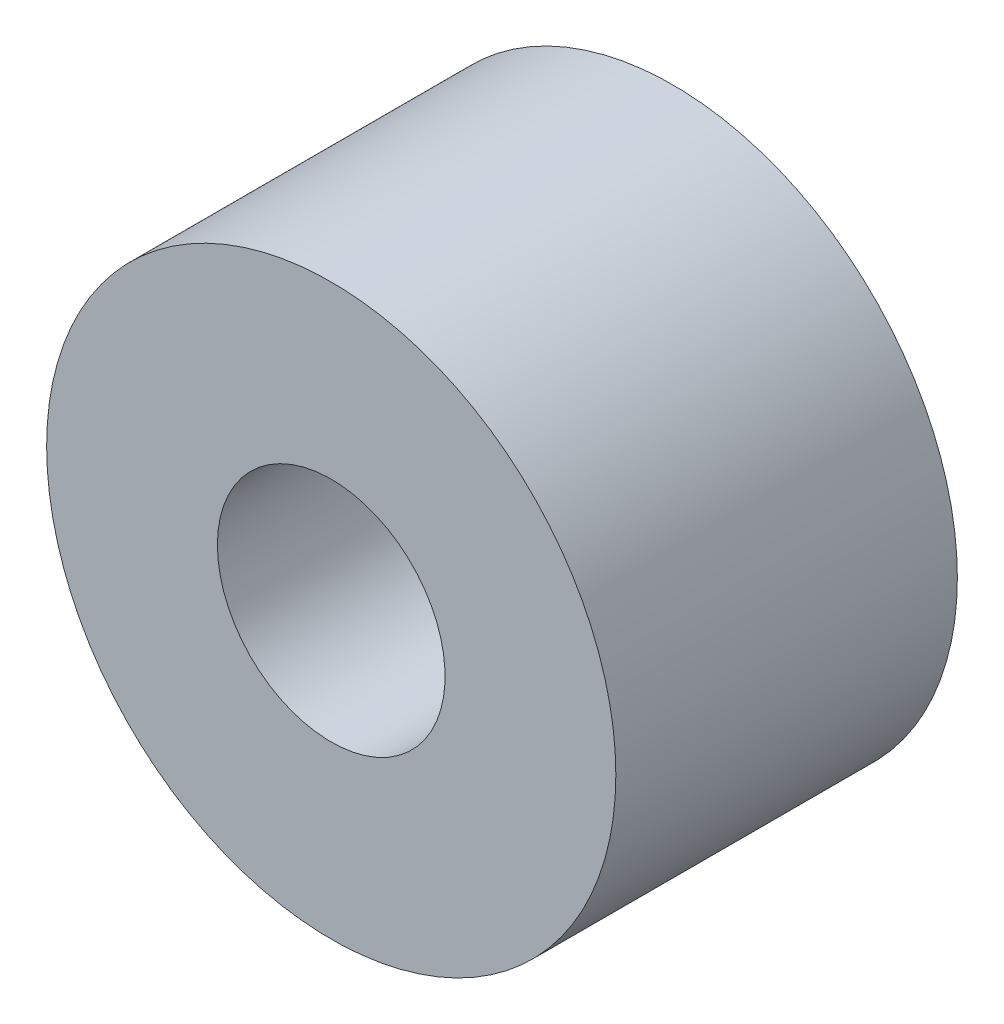
ISO-10303-21;
HEADER;
FILE_DESCRIPTION(('STEP AP214'),'2;1');
FILE_NAME('part.step','',(''),(''),'','','');
FILE_SCHEMA(('AUTOMOTIVE_DESIGN { 1 0 10303 214 1 1 1 1 }'));
ENDSEC;
DATA;
#1=APPLICATION_CONTEXT('core data for automotive mechanical design processes');
#2=APPLICATION_PROTOCOL_DEFINITION('international standard','automotive_design',2000,#1);
#3=PRODUCT_CONTEXT('',#1,'mechanical');
#4=PRODUCT('Part','Part','',(#3));
#5=PRODUCT_RELATED_PRODUCT_CATEGORY('part','',(#4));
#6=PRODUCT_DEFINITION_FORMATION('','',#4);
#7=PRODUCT_DEFINITION_CONTEXT('part definition',#1,'design');
#8=PRODUCT_DEFINITION('design','',#6,#7);
#9=PRODUCT_DEFINITION_SHAPE('','',#8);
#10=(LENGTH_UNIT() NAMED_UNIT(*) SI_UNIT(.MILLI.,.METRE.));
#11=(NAMED_UNIT(*) PLANE_ANGLE_UNIT() SI_UNIT($,.RADIAN.));
#12=(NAMED_UNIT(*) SI_UNIT($,.STERADIAN.) SOLID_ANGLE_UNIT());
#13=UNCERTAINTY_MEASURE_WITH_UNIT(LENGTH_MEASURE(1.E-05),#10,'distance_accuracy_value','');
#14=(GEOMETRIC_REPRESENTATION_CONTEXT(3) GLOBAL_UNCERTAINTY_ASSIGNED_CONTEXT((#13)) GLOBAL_UNIT_ASSIGNED_CONTEXT((#10,
#11,#12)) REPRESENTATION_CONTEXT('',''));
#15=CARTESIAN_POINT('',(0.,0.,0.));
#16=DIRECTION('',(0.,0.,1.));
#17=DIRECTION('',(1.,0.,0.));
#18=AXIS2_PLACEMENT_3D('',#15,#16,#17);
#19=CARTESIAN_POINT('',(0.,0.,45.));
#20=DIRECTION('',(0.,0.,1.));
#21=DIRECTION('',(1.,0.,0.));
#22=AXIS2_PLACEMENT_3D('',#19,#20,#21);
#23=PLANE('',#22);
#24=CARTESIAN_POINT('',(0.,0.,45.));
#25=DIRECTION('',(0.,0.,1.));
#26=DIRECTION('',(1.,0.,0.));
#27=AXIS2_PLACEMENT_3D('',#24,#25,#26);
#28=CIRCLE('',#27,37.5);
#29=CARTESIAN_POINT('',(-37.5,0.,45.));
#30=VERTEX_POINT('',#29);
#31=EDGE_CURVE('E10',#30,#30,#28,.T.);
#32=ORIENTED_EDGE('',*,*,#31,.T.);
#33=EDGE_LOOP('',(#32));
#34=FACE_BOUND('',#33,.T.);
#35=CARTESIAN_POINT('',(0.,0.,45.));
#36=DIRECTION('',(0.,0.,1.));
#37=DIRECTION('',(1.,0.,0.));
#38=AXIS2_PLACEMENT_3D('',#35,#36,#37);
#39=CIRCLE('',#38,15.);
#40=CARTESIAN_POINT('',(-15.,0.,45.));
#41=VERTEX_POINT('',#40);
#42=EDGE_CURVE('E55',#41,#41,#39,.T.);
#43=ORIENTED_EDGE('',*,*,#42,.F.);
#44=EDGE_LOOP('',(#43));
#45=FACE_BOUND('',#44,.T.);
#46=ADVANCED_FACE('F41',(#34,#45),#23,.T.);
#47=CARTESIAN_POINT('',(0.,0.,0.));
#48=DIRECTION('',(0.,0.,1.));
#49=DIRECTION('',(1.,0.,0.));
#50=AXIS2_PLACEMENT_3D('',#47,#48,#49);
#51=PLANE('',#50);
#52=CARTESIAN_POINT('',(0.,0.,0.));
#53=DIRECTION('',(0.,0.,1.));
#54=DIRECTION('',(1.,0.,0.));
#55=AXIS2_PLACEMENT_3D('',#52,#53,#54);
#56=CIRCLE('',#55,37.5);
#57=CARTESIAN_POINT('',(-37.5,0.,0.));
#58=VERTEX_POINT('',#57);
#59=EDGE_CURVE('E44',#58,#58,#56,.T.);
#60=ORIENTED_EDGE('',*,*,#59,.F.);
#61=EDGE_LOOP('',(#60));
#62=FACE_BOUND('',#61,.T.);
#63=CARTESIAN_POINT('',(0.,0.,0.));
#64=DIRECTION('',(0.,0.,1.));
#65=DIRECTION('',(1.,0.,0.));
#66=AXIS2_PLACEMENT_3D('',#63,#64,#65);
#67=CIRCLE('',#66,15.);
#68=CARTESIAN_POINT('',(-15.,0.,0.));
#69=VERTEX_POINT('',#68);
#70=EDGE_CURVE('E53',#69,#69,#67,.T.);
#71=ORIENTED_EDGE('',*,*,#70,.T.);
#72=EDGE_LOOP('',(#71));
#73=FACE_BOUND('',#72,.T.);
#74=ADVANCED_FACE('F61',(#62,#73),#51,.F.);
#75=CARTESIAN_POINT('',(0.,0.,45.));
#76=DIRECTION('',(0.,0.,-1.));
#77=DIRECTION('',(-1.,0.,0.));
#78=AXIS2_PLACEMENT_3D('',#75,#76,#77);
#79=CYLINDRICAL_SURFACE('',#78,37.5);
#80=CARTESIAN_POINT('',(-37.5,0.,45.));
#81=CARTESIAN_POINT('',(-37.5,0.,44.53125));
#82=CARTESIAN_POINT('',(-37.5,0.,44.0625));
#83=CARTESIAN_POINT('',(-37.5,0.,43.125));
#84=CARTESIAN_POINT('',(-37.5,0.,42.65625));
#85=CARTESIAN_POINT('',(-37.5,0.,41.71875));
#86=CARTESIAN_POINT('',(-37.5,0.,41.25));
#87=CARTESIAN_POINT('',(-37.5,0.,40.3125));
#88=CARTESIAN_POINT('',(-37.5,0.,39.84375));
#89=CARTESIAN_POINT('',(-37.5,0.,38.90625));
#90=CARTESIAN_POINT('',(-37.5,0.,38.4375));
#91=CARTESIAN_POINT('',(-37.5,0.,37.5));
#92=CARTESIAN_POINT('',(-37.5,0.,37.03125));
#93=CARTESIAN_POINT('',(-37.5,0.,36.09375));
#94=CARTESIAN_POINT('',(-37.5,0.,35.625));
#95=CARTESIAN_POINT('',(-37.5,0.,34.6875));
#96=CARTESIAN_POINT('',(-37.5,0.,34.21875));
#97=CARTESIAN_POINT('',(-37.5,0.,33.28125));
#98=CARTESIAN_POINT('',(-37.5,0.,32.8125));
#99=CARTESIAN_POINT('',(-37.5,0.,31.875));
#100=CARTESIAN_POINT('',(-37.5,0.,31.40625));
#101=CARTESIAN_POINT('',(-37.5,0.,30.46875));
#102=CARTESIAN_POINT('',(-37.5,0.,30.));
#103=CARTESIAN_POINT('',(-37.5,0.,29.0625));
#104=CARTESIAN_POINT('',(-37.5,0.,28.59375));
#105=CARTESIAN_POINT('',(-37.5,0.,27.65625));
#106=CARTESIAN_POINT('',(-37.5,0.,27.1875));
#107=CARTESIAN_POINT('',(-37.5,0.,26.25));
#108=CARTESIAN_POINT('',(-37.5,0.,25.78125));
#109=CARTESIAN_POINT('',(-37.5,0.,24.84375));
#110=CARTESIAN_POINT('',(-37.5,0.,24.375));
#111=CARTESIAN_POINT('',(-37.5,0.,23.4375));
#112=CARTESIAN_POINT('',(-37.5,0.,22.96875));
#113=CARTESIAN_POINT('',(-37.5,0.,22.03125));
#114=CARTESIAN_POINT('',(-37.5,0.,21.5625));
#115=CARTESIAN_POINT('',(-37.5,0.,20.625));
#116=CARTESIAN_POINT('',(-37.5,0.,20.15625));
#117=CARTESIAN_POINT('',(-37.5,0.,19.21875));
#118=CARTESIAN_POINT('',(-37.5,0.,18.75));
#119=CARTESIAN_POINT('',(-37.5,0.,17.8125));
#120=CARTESIAN_POINT('',(-37.5,0.,17.34375));
#121=CARTESIAN_POINT('',(-37.5,0.,16.40625));
#122=CARTESIAN_POINT('',(-37.5,0.,15.9375));
#123=CARTESIAN_POINT('',(-37.5,0.,15.));
#124=CARTESIAN_POINT('',(-37.5,0.,14.53125));
#125=CARTESIAN_POINT('',(-37.5,0.,13.59375));
#126=CARTESIAN_POINT('',(-37.5,0.,13.125));
#127=CARTESIAN_POINT('',(-37.5,0.,12.1875));
#128=CARTESIAN_POINT('',(-37.5,0.,11.71875));
#129=CARTESIAN_POINT('',(-37.5,0.,10.78125));
#130=CARTESIAN_POINT('',(-37.5,0.,10.3125));
#131=CARTESIAN_POINT('',(-37.5,0.,9.375));
#132=CARTESIAN_POINT('',(-37.5,0.,8.90625));
#133=CARTESIAN_POINT('',(-37.5,0.,7.96874999999999));
#134=CARTESIAN_POINT('',(-37.5,0.,7.5));
#135=CARTESIAN_POINT('',(-37.5,0.,6.5625));
#136=CARTESIAN_POINT('',(-37.5,0.,6.09375));
#137=CARTESIAN_POINT('',(-37.5,0.,5.15625));
#138=CARTESIAN_POINT('',(-37.5,0.,4.68749999999999));
#139=CARTESIAN_POINT('',(-37.5,0.,3.74999999999999));
#140=CARTESIAN_POINT('',(-37.5,0.,3.28124999999999));
#141=CARTESIAN_POINT('',(-37.5,0.,2.34374999999999));
#142=CARTESIAN_POINT('',(-37.5,0.,1.87499999999999));
#143=CARTESIAN_POINT('',(-37.5,0.,0.937499999999992));
#144=CARTESIAN_POINT('',(-37.5,0.,0.468749999999993));
#145=CARTESIAN_POINT('',(-37.5,0.,0.));
#146=B_SPLINE_CURVE_WITH_KNOTS('',3,(#80,#81,#82,#83,#84,#85,#86,#87,#88,#89,#90,#91,#92,#93,
#94,#95,#96,#97,#98,#99,#100,#101,#102,#103,#104,#105,#106,#107,#108,#109,#110,#111,#112,#113,
#114,#115,#116,#117,#118,#119,#120,#121,#122,#123,#124,#125,#126,#127,#128,#129,#130,#131,#132,
#133,#134,#135,#136,#137,#138,#139,#140,#141,#142,#143,#144,#145),.UNSPECIFIED.,.F.,.F.,(4,2,2,
2,2,2,2,2,2,2,2,2,2,2,2,2,2,2,2,2,2,2,2,2,2,2,2,2,2,2,2,2,4),(0.,1.40625,2.8125,
4.21875000000001,5.62500000000001,7.03125,8.4375,9.84375000000001,11.25,12.65625,14.0625,
15.46875,16.875,18.28125,19.6875,21.09375,22.5,23.90625,25.3125,26.71875,28.125,29.53125,
30.9375,32.34375,33.75,35.15625,36.5625,37.96875,39.375,40.78125,42.1875,43.59375,45.),.UNSPECIFIED.);
#147=EDGE_CURVE('BSEAM43',#30,#58,#146,.T.);
#148=ORIENTED_EDGE('',*,*,#31,.F.);
#149=ORIENTED_EDGE('',*,*,#59,.T.);
#150=ORIENTED_EDGE('',*,*,#147,.T.);
#151=ORIENTED_EDGE('',*,*,#147,.F.);
#152=EDGE_LOOP('',(#148,#150,#149,#151));
#153=FACE_BOUND('',#152,.T.);
#154=ADVANCED_FACE('F43',(#153),#79,.T.);
#155=CARTESIAN_POINT('',(0.,0.,45.));
#156=DIRECTION('',(0.,0.,-1.));
#157=DIRECTION('',(-1.,0.,0.));
#158=AXIS2_PLACEMENT_3D('',#155,#156,#157);
#159=CYLINDRICAL_SURFACE('',#158,15.);
#160=CARTESIAN_POINT('',(-15.,0.,45.));
#161=CARTESIAN_POINT('',(-15.,0.,44.53125));
#162=CARTESIAN_POINT('',(-15.,0.,44.0625));
#163=CARTESIAN_POINT('',(-15.,0.,43.125));
#164=CARTESIAN_POINT('',(-15.,0.,42.65625));
#165=CARTESIAN_POINT('',(-15.,0.,41.71875));
#166=CARTESIAN_POINT('',(-15.,0.,41.25));
#167=CARTESIAN_POINT('',(-15.,0.,40.3125));
#168=CARTESIAN_POINT('',(-15.,0.,39.84375));
#169=CARTESIAN_POINT('',(-15.,0.,38.90625));
#170=CARTESIAN_POINT('',(-15.,0.,38.4375));
#171=CARTESIAN_POINT('',(-15.,0.,37.5));
#172=CARTESIAN_POINT('',(-15.,0.,37.03125));
#173=CARTESIAN_POINT('',(-15.,0.,36.09375));
#174=CARTESIAN_POINT('',(-15.,0.,35.625));
#175=CARTESIAN_POINT('',(-15.,0.,34.6875));
#176=CARTESIAN_POINT('',(-15.,0.,34.21875));
#177=CARTESIAN_POINT('',(-15.,0.,33.28125));
#178=CARTESIAN_POINT('',(-15.,0.,32.8125));
#179=CARTESIAN_POINT('',(-15.,0.,31.875));
#180=CARTESIAN_POINT('',(-15.,0.,31.40625));
#181=CARTESIAN_POINT('',(-15.,0.,30.46875));
#182=CARTESIAN_POINT('',(-15.,0.,30.));
#183=CARTESIAN_POINT('',(-15.,0.,29.0625));
#184=CARTESIAN_POINT('',(-15.,0.,28.59375));
#185=CARTESIAN_POINT('',(-15.,0.,27.65625));
#186=CARTESIAN_POINT('',(-15.,0.,27.1875));
#187=CARTESIAN_POINT('',(-15.,0.,26.25));
#188=CARTESIAN_POINT('',(-15.,0.,25.78125));
#189=CARTESIAN_POINT('',(-15.,0.,24.84375));
#190=CARTESIAN_POINT('',(-15.,0.,24.375));
#191=CARTESIAN_POINT('',(-15.,0.,23.4375));
#192=CARTESIAN_POINT('',(-15.,0.,22.96875));
#193=CARTESIAN_POINT('',(-15.,0.,22.03125));
#194=CARTESIAN_POINT('',(-15.,0.,21.5625));
#195=CARTESIAN_POINT('',(-15.,0.,20.625));
#196=CARTESIAN_POINT('',(-15.,0.,20.15625));
#197=CARTESIAN_POINT('',(-15.,0.,19.21875));
#198=CARTESIAN_POINT('',(-15.,0.,18.75));
#199=CARTESIAN_POINT('',(-15.,0.,17.8125));
#200=CARTESIAN_POINT('',(-15.,0.,17.34375));
#201=CARTESIAN_POINT('',(-15.,0.,16.40625));
#202=CARTESIAN_POINT('',(-15.,0.,15.9375));
#203=CARTESIAN_POINT('',(-15.,0.,15.));
#204=CARTESIAN_POINT('',(-15.,0.,14.53125));
#205=CARTESIAN_POINT('',(-15.,0.,13.59375));
#206=CARTESIAN_POINT('',(-15.,0.,13.125));
#207=CARTESIAN_POINT('',(-15.,0.,12.1875));
#208=CARTESIAN_POINT('',(-15.,0.,11.71875));
#209=CARTESIAN_POINT('',(-15.,0.,10.78125));
#210=CARTESIAN_POINT('',(-15.,0.,10.3125));
#211=CARTESIAN_POINT('',(-15.,0.,9.37499999999999));
#212=CARTESIAN_POINT('',(-15.,0.,8.90624999999999));
#213=CARTESIAN_POINT('',(-15.,0.,7.96874999999999));
#214=CARTESIAN_POINT('',(-15.,0.,7.5));
#215=CARTESIAN_POINT('',(-15.,0.,6.56249999999999));
#216=CARTESIAN_POINT('',(-15.,0.,6.09374999999999));
#217=CARTESIAN_POINT('',(-15.,0.,5.15624999999999));
#218=CARTESIAN_POINT('',(-15.,0.,4.68749999999999));
#219=CARTESIAN_POINT('',(-15.,0.,3.74999999999999));
#220=CARTESIAN_POINT('',(-15.,0.,3.28124999999999));
#221=CARTESIAN_POINT('',(-15.,0.,2.34374999999999));
#222=CARTESIAN_POINT('',(-15.,0.,1.87499999999999));
#223=CARTESIAN_POINT('',(-15.,0.,0.937499999999992));
#224=CARTESIAN_POINT('',(-15.,0.,0.468749999999993));
#225=CARTESIAN_POINT('',(-15.,0.,0.));
#226=B_SPLINE_CURVE_WITH_KNOTS('',3,(#160,#161,#162,#163,#164,#165,#166,#167,#168,#169,#170,
#171,#172,#173,#174,#175,#176,#177,#178,#179,#180,#181,#182,#183,#184,#185,#186,#187,#188,#189,
#190,#191,#192,#193,#194,#195,#196,#197,#198,#199,#200,#201,#202,#203,#204,#205,#206,#207,#208,
#209,#210,#211,#212,#213,#214,#215,#216,#217,#218,#219,#220,#221,#222,#223,#224,#225),
.UNSPECIFIED.,.F.,.F.,(4,2,2,2,2,2,2,2,2,2,2,2,2,2,2,2,2,2,2,2,2,2,2,2,2,2,2,2,2,2,2,2,4),(0.,
1.40625,2.8125,4.21874999999999,5.625,7.03125,8.43749999999999,9.84375,11.25,12.65625,14.0625,
15.46875,16.875,18.28125,19.6875,21.09375,22.5,23.90625,25.3125,26.71875,28.125,29.53125,
30.9375,32.34375,33.75,35.15625,36.5625,37.96875,39.375,40.78125,42.1875,43.59375,45.),.UNSPECIFIED.);
#227=EDGE_CURVE('BSEAM58',#41,#69,#226,.T.);
#228=ORIENTED_EDGE('',*,*,#42,.T.);
#229=ORIENTED_EDGE('',*,*,#70,.F.);
#230=ORIENTED_EDGE('',*,*,#227,.T.);
#231=ORIENTED_EDGE('',*,*,#227,.F.);
#232=EDGE_LOOP('',(#228,#230,#229,#231));
#233=FACE_BOUND('',#232,.T.);
#234=ADVANCED_FACE('F58',(#233),#159,.F.);
#235=CLOSED_SHELL('',(#46,#74,#154,#234));
#236=MANIFOLD_SOLID_BREP('B2',#235);
#237=ADVANCED_BREP_SHAPE_REPRESENTATION('',(#18,#236),#14);
#238=SHAPE_DEFINITION_REPRESENTATION(#9,#237);
ENDSEC;
END-ISO-10303-21;
